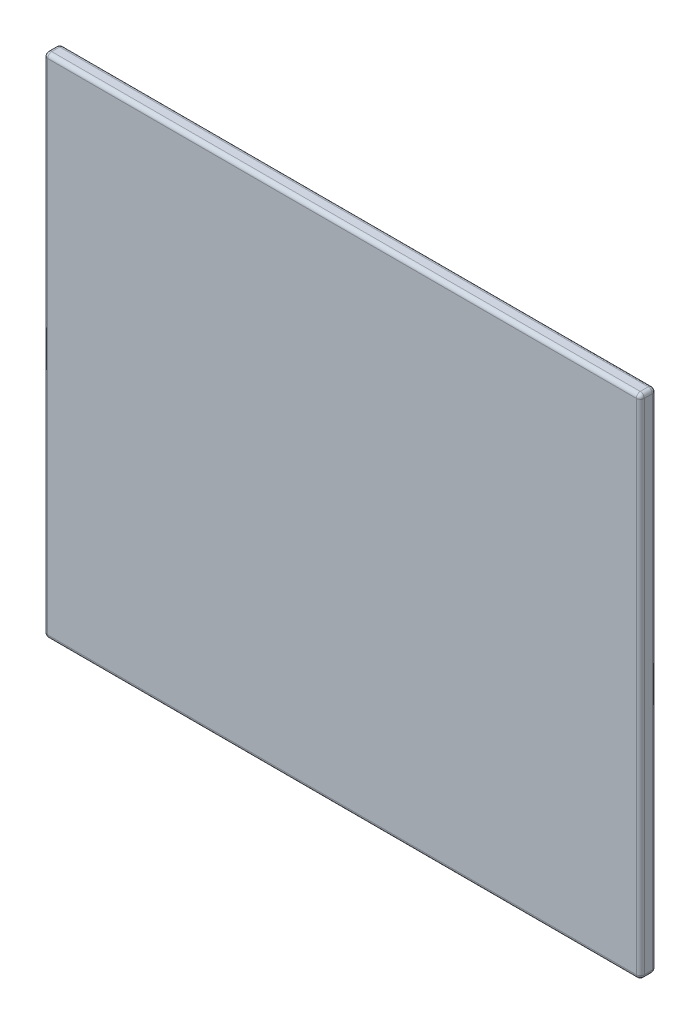
ISO-10303-21;
HEADER;
FILE_DESCRIPTION(('STEP AP214'),'2;1');
FILE_NAME('part.step','',(''),(''),'','','');
FILE_SCHEMA(('AUTOMOTIVE_DESIGN { 1 0 10303 214 1 1 1 1 }'));
ENDSEC;
DATA;
#1=APPLICATION_CONTEXT('core data for automotive mechanical design processes');
#2=APPLICATION_PROTOCOL_DEFINITION('international standard','automotive_design',2000,#1);
#3=PRODUCT_CONTEXT('',#1,'mechanical');
#4=PRODUCT('Part','Part','',(#3));
#5=PRODUCT_RELATED_PRODUCT_CATEGORY('part','',(#4));
#6=PRODUCT_DEFINITION_FORMATION('','',#4);
#7=PRODUCT_DEFINITION_CONTEXT('part definition',#1,'design');
#8=PRODUCT_DEFINITION('design','',#6,#7);
#9=PRODUCT_DEFINITION_SHAPE('','',#8);
#10=(LENGTH_UNIT() NAMED_UNIT(*) SI_UNIT(.MILLI.,.METRE.));
#11=(NAMED_UNIT(*) PLANE_ANGLE_UNIT() SI_UNIT($,.RADIAN.));
#12=(NAMED_UNIT(*) SI_UNIT($,.STERADIAN.) SOLID_ANGLE_UNIT());
#13=UNCERTAINTY_MEASURE_WITH_UNIT(LENGTH_MEASURE(1.E-05),#10,'distance_accuracy_value','');
#14=(GEOMETRIC_REPRESENTATION_CONTEXT(3) GLOBAL_UNCERTAINTY_ASSIGNED_CONTEXT((#13)) GLOBAL_UNIT_ASSIGNED_CONTEXT((#10,
#11,#12)) REPRESENTATION_CONTEXT('',''));
#15=CARTESIAN_POINT('',(0.,0.,0.));
#16=DIRECTION('',(0.,0.,1.));
#17=DIRECTION('',(1.,0.,0.));
#18=AXIS2_PLACEMENT_3D('',#15,#16,#17);
#19=CARTESIAN_POINT('',(37.35,-31.75,2.));
#20=DIRECTION('',(-1.,0.,0.));
#21=DIRECTION('',(0.,0.,1.));
#22=AXIS2_PLACEMENT_3D('',#19,#20,#21);
#23=PLANE('',#22);
#24=DIRECTION('',(0.,1.,0.));
#25=VECTOR('',#24,1.);
#26=CARTESIAN_POINT('',(37.35,-31.75,1.5));
#27=LINE('',#26,#25);
#28=CARTESIAN_POINT('',(37.35,31.25,1.5));
#29=VERTEX_POINT('',#28);
#30=CARTESIAN_POINT('',(37.35,-31.25,1.5));
#31=VERTEX_POINT('',#30);
#32=EDGE_CURVE('E42',#29,#31,#27,.F.);
#33=ORIENTED_EDGE('',*,*,#32,.T.);
#34=DIRECTION('',(0.,0.,-1.));
#35=VECTOR('',#34,1.);
#36=CARTESIAN_POINT('',(37.35,-31.25,2.));
#37=LINE('',#36,#35);
#38=CARTESIAN_POINT('',(37.35,-31.25,0.5));
#39=VERTEX_POINT('',#38);
#40=EDGE_CURVE('E11',#31,#39,#37,.T.);
#41=ORIENTED_EDGE('',*,*,#40,.T.);
#42=DIRECTION('',(0.,1.,0.));
#43=VECTOR('',#42,1.);
#44=CARTESIAN_POINT('',(37.35,31.75,0.5));
#45=LINE('',#44,#43);
#46=CARTESIAN_POINT('',(37.35,31.25,0.5));
#47=VERTEX_POINT('',#46);
#48=EDGE_CURVE('E194',#39,#47,#45,.T.);
#49=ORIENTED_EDGE('',*,*,#48,.T.);
#50=DIRECTION('',(0.,0.,-1.));
#51=VECTOR('',#50,1.);
#52=CARTESIAN_POINT('',(37.35,31.25,2.));
#53=LINE('',#52,#51);
#54=EDGE_CURVE('E53',#47,#29,#53,.F.);
#55=ORIENTED_EDGE('',*,*,#54,.T.);
#56=EDGE_LOOP('',(#33,#41,#49,#55));
#57=FACE_BOUND('',#56,.T.);
#58=ADVANCED_FACE('F33',(#57),#23,.F.);
#59=CARTESIAN_POINT('',(-37.35,31.75,2.));
#60=DIRECTION('',(0.,-1.,0.));
#61=DIRECTION('',(0.,0.,-1.));
#62=AXIS2_PLACEMENT_3D('',#59,#60,#61);
#63=PLANE('',#62);
#64=DIRECTION('',(0.,0.,-1.));
#65=VECTOR('',#64,1.);
#66=CARTESIAN_POINT('',(-36.85,31.75,2.));
#67=LINE('',#66,#65);
#68=CARTESIAN_POINT('',(-36.85,31.75,0.5));
#69=VERTEX_POINT('',#68);
#70=CARTESIAN_POINT('',(-36.85,31.75,1.5));
#71=VERTEX_POINT('',#70);
#72=EDGE_CURVE('E189',#69,#71,#67,.F.);
#73=ORIENTED_EDGE('',*,*,#72,.T.);
#74=DIRECTION('',(-1.,0.,0.));
#75=VECTOR('',#74,1.);
#76=CARTESIAN_POINT('',(-37.35,31.75,1.5));
#77=LINE('',#76,#75);
#78=CARTESIAN_POINT('',(36.85,31.75,1.5));
#79=VERTEX_POINT('',#78);
#80=EDGE_CURVE('E191',#71,#79,#77,.F.);
#81=ORIENTED_EDGE('',*,*,#80,.T.);
#82=DIRECTION('',(0.,0.,-1.));
#83=VECTOR('',#82,1.);
#84=CARTESIAN_POINT('',(36.85,31.75,2.));
#85=LINE('',#84,#83);
#86=CARTESIAN_POINT('',(36.85,31.75,0.5));
#87=VERTEX_POINT('',#86);
#88=EDGE_CURVE('E185',#79,#87,#85,.T.);
#89=ORIENTED_EDGE('',*,*,#88,.T.);
#90=DIRECTION('',(-1.,0.,0.));
#91=VECTOR('',#90,1.);
#92=CARTESIAN_POINT('',(-37.35,31.75,0.5));
#93=LINE('',#92,#91);
#94=EDGE_CURVE('E187',#87,#69,#93,.T.);
#95=ORIENTED_EDGE('',*,*,#94,.T.);
#96=EDGE_LOOP('',(#73,#81,#89,#95));
#97=FACE_BOUND('',#96,.T.);
#98=ADVANCED_FACE('F278',(#97),#63,.F.);
#99=CARTESIAN_POINT('',(-37.35,-31.75,2.));
#100=DIRECTION('',(1.,0.,0.));
#101=DIRECTION('',(0.,0.,-1.));
#102=AXIS2_PLACEMENT_3D('',#99,#100,#101);
#103=PLANE('',#102);
#104=DIRECTION('',(0.,0.,-1.));
#105=VECTOR('',#104,1.);
#106=CARTESIAN_POINT('',(-37.35,-31.25,2.));
#107=LINE('',#106,#105);
#108=CARTESIAN_POINT('',(-37.35,-31.25,0.5));
#109=VERTEX_POINT('',#108);
#110=CARTESIAN_POINT('',(-37.35,-31.25,1.5));
#111=VERTEX_POINT('',#110);
#112=EDGE_CURVE('E180',#109,#111,#107,.F.);
#113=ORIENTED_EDGE('',*,*,#112,.T.);
#114=DIRECTION('',(0.,-1.,0.));
#115=VECTOR('',#114,1.);
#116=CARTESIAN_POINT('',(-37.35,-31.75,1.5));
#117=LINE('',#116,#115);
#118=CARTESIAN_POINT('',(-37.35,31.25,1.5));
#119=VERTEX_POINT('',#118);
#120=EDGE_CURVE('E182',#111,#119,#117,.F.);
#121=ORIENTED_EDGE('',*,*,#120,.T.);
#122=DIRECTION('',(0.,0.,-1.));
#123=VECTOR('',#122,1.);
#124=CARTESIAN_POINT('',(-37.35,31.25,2.));
#125=LINE('',#124,#123);
#126=CARTESIAN_POINT('',(-37.35,31.25,0.5));
#127=VERTEX_POINT('',#126);
#128=EDGE_CURVE('E176',#119,#127,#125,.T.);
#129=ORIENTED_EDGE('',*,*,#128,.T.);
#130=DIRECTION('',(0.,-1.,0.));
#131=VECTOR('',#130,1.);
#132=CARTESIAN_POINT('',(-37.35,-31.75,0.5));
#133=LINE('',#132,#131);
#134=EDGE_CURVE('E178',#127,#109,#133,.T.);
#135=ORIENTED_EDGE('',*,*,#134,.T.);
#136=EDGE_LOOP('',(#113,#121,#129,#135));
#137=FACE_BOUND('',#136,.T.);
#138=ADVANCED_FACE('F269',(#137),#103,.F.);
#139=CARTESIAN_POINT('',(-37.35,-31.75,2.));
#140=DIRECTION('',(0.,1.,0.));
#141=DIRECTION('',(0.,0.,1.));
#142=AXIS2_PLACEMENT_3D('',#139,#140,#141);
#143=PLANE('',#142);
#144=DIRECTION('',(1.,0.,0.));
#145=VECTOR('',#144,1.);
#146=CARTESIAN_POINT('',(-37.35,-31.75,1.5));
#147=LINE('',#146,#145);
#148=CARTESIAN_POINT('',(36.85,-31.75,1.5));
#149=VERTEX_POINT('',#148);
#150=CARTESIAN_POINT('',(-36.85,-31.75,1.5));
#151=VERTEX_POINT('',#150);
#152=EDGE_CURVE('E129',#149,#151,#147,.F.);
#153=ORIENTED_EDGE('',*,*,#152,.T.);
#154=DIRECTION('',(0.,0.,-1.));
#155=VECTOR('',#154,1.);
#156=CARTESIAN_POINT('',(-36.85,-31.75,2.));
#157=LINE('',#156,#155);
#158=CARTESIAN_POINT('',(-36.85,-31.75,0.5));
#159=VERTEX_POINT('',#158);
#160=EDGE_CURVE('E165',#151,#159,#157,.T.);
#161=ORIENTED_EDGE('',*,*,#160,.T.);
#162=DIRECTION('',(1.,0.,0.));
#163=VECTOR('',#162,1.);
#164=CARTESIAN_POINT('',(37.35,-31.75,0.5));
#165=LINE('',#164,#163);
#166=CARTESIAN_POINT('',(36.85,-31.75,0.5));
#167=VERTEX_POINT('',#166);
#168=EDGE_CURVE('E158',#159,#167,#165,.T.);
#169=ORIENTED_EDGE('',*,*,#168,.T.);
#170=DIRECTION('',(0.,0.,-1.));
#171=VECTOR('',#170,1.);
#172=CARTESIAN_POINT('',(36.85,-31.75,2.));
#173=LINE('',#172,#171);
#174=EDGE_CURVE('E156',#167,#149,#173,.F.);
#175=ORIENTED_EDGE('',*,*,#174,.T.);
#176=EDGE_LOOP('',(#153,#161,#169,#175));
#177=FACE_BOUND('',#176,.T.);
#178=ADVANCED_FACE('F356',(#177),#143,.F.);
#179=CARTESIAN_POINT('',(0.,0.,2.));
#180=DIRECTION('',(0.,0.,-1.));
#181=DIRECTION('',(-1.,0.,0.));
#182=AXIS2_PLACEMENT_3D('',#179,#180,#181);
#183=PLANE('',#182);
#184=DIRECTION('',(0.,-1.,0.));
#185=VECTOR('',#184,1.);
#186=CARTESIAN_POINT('',(-36.85,0.,2.));
#187=LINE('',#186,#185);
#188=CARTESIAN_POINT('',(-36.85,31.25,2.));
#189=VERTEX_POINT('',#188);
#190=CARTESIAN_POINT('',(-36.85,-31.25,2.));
#191=VERTEX_POINT('',#190);
#192=EDGE_CURVE('E154',#189,#191,#187,.T.);
#193=ORIENTED_EDGE('',*,*,#192,.T.);
#194=DIRECTION('',(1.,0.,0.));
#195=VECTOR('',#194,1.);
#196=CARTESIAN_POINT('',(0.,-31.25,2.));
#197=LINE('',#196,#195);
#198=CARTESIAN_POINT('',(36.85,-31.25,2.));
#199=VERTEX_POINT('',#198);
#200=EDGE_CURVE('E127',#191,#199,#197,.T.);
#201=ORIENTED_EDGE('',*,*,#200,.T.);
#202=DIRECTION('',(0.,1.,0.));
#203=VECTOR('',#202,1.);
#204=CARTESIAN_POINT('',(36.85,0.,2.));
#205=LINE('',#204,#203);
#206=CARTESIAN_POINT('',(36.85,31.25,2.));
#207=VERTEX_POINT('',#206);
#208=EDGE_CURVE('E144',#199,#207,#205,.T.);
#209=ORIENTED_EDGE('',*,*,#208,.T.);
#210=DIRECTION('',(-1.,0.,0.));
#211=VECTOR('',#210,1.);
#212=CARTESIAN_POINT('',(0.,31.25,2.));
#213=LINE('',#212,#211);
#214=EDGE_CURVE('E150',#207,#189,#213,.T.);
#215=ORIENTED_EDGE('',*,*,#214,.T.);
#216=EDGE_LOOP('',(#193,#201,#209,#215));
#217=FACE_BOUND('',#216,.T.);
#218=ADVANCED_FACE('F152',(#217),#183,.F.);
#219=CARTESIAN_POINT('',(0.,0.,0.));
#220=DIRECTION('',(0.,0.,-1.));
#221=DIRECTION('',(-1.,0.,0.));
#222=AXIS2_PLACEMENT_3D('',#219,#220,#221);
#223=PLANE('',#222);
#224=DIRECTION('',(0.,1.,0.));
#225=VECTOR('',#224,1.);
#226=CARTESIAN_POINT('',(36.85,-31.75,0.));
#227=LINE('',#226,#225);
#228=CARTESIAN_POINT('',(36.85,31.25,0.));
#229=VERTEX_POINT('',#228);
#230=CARTESIAN_POINT('',(36.85,-31.25,0.));
#231=VERTEX_POINT('',#230);
#232=EDGE_CURVE('E167',#229,#231,#227,.F.);
#233=ORIENTED_EDGE('',*,*,#232,.T.);
#234=DIRECTION('',(1.,0.,0.));
#235=VECTOR('',#234,1.);
#236=CARTESIAN_POINT('',(-37.35,-31.25,0.));
#237=LINE('',#236,#235);
#238=CARTESIAN_POINT('',(-36.85,-31.25,0.));
#239=VERTEX_POINT('',#238);
#240=EDGE_CURVE('E173',#231,#239,#237,.F.);
#241=ORIENTED_EDGE('',*,*,#240,.T.);
#242=DIRECTION('',(0.,-1.,0.));
#243=VECTOR('',#242,1.);
#244=CARTESIAN_POINT('',(-36.85,31.75,0.));
#245=LINE('',#244,#243);
#246=CARTESIAN_POINT('',(-36.85,31.25,0.));
#247=VERTEX_POINT('',#246);
#248=EDGE_CURVE('E171',#239,#247,#245,.F.);
#249=ORIENTED_EDGE('',*,*,#248,.T.);
#250=DIRECTION('',(-1.,0.,0.));
#251=VECTOR('',#250,1.);
#252=CARTESIAN_POINT('',(37.35,31.25,0.));
#253=LINE('',#252,#251);
#254=EDGE_CURVE('E169',#247,#229,#253,.F.);
#255=ORIENTED_EDGE('',*,*,#254,.T.);
#256=EDGE_LOOP('',(#233,#241,#249,#255));
#257=FACE_BOUND('',#256,.T.);
#258=ADVANCED_FACE('F296',(#257),#223,.T.);
#259=CARTESIAN_POINT('',(-37.35,31.25,0.5));
#260=DIRECTION('',(1.,0.,0.));
#261=DIRECTION('',(0.,0.,-1.));
#262=AXIS2_PLACEMENT_3D('',#259,#260,#261);
#263=CYLINDRICAL_SURFACE('',#262,0.5);
#264=CARTESIAN_POINT('',(-36.85,31.25,0.5));
#265=DIRECTION('',(-1.,0.,0.));
#266=DIRECTION('',(0.,0.,1.));
#267=AXIS2_PLACEMENT_3D('',#264,#265,#266);
#268=CIRCLE('',#267,0.5);
#269=EDGE_CURVE('E37',#69,#247,#268,.T.);
#270=ORIENTED_EDGE('',*,*,#269,.F.);
#271=ORIENTED_EDGE('',*,*,#94,.F.);
#272=CARTESIAN_POINT('',(36.85,31.25,0.5));
#273=DIRECTION('',(1.,0.,0.));
#274=DIRECTION('',(0.,0.,-1.));
#275=AXIS2_PLACEMENT_3D('',#272,#273,#274);
#276=CIRCLE('',#275,0.5);
#277=EDGE_CURVE('E246',#229,#87,#276,.T.);
#278=ORIENTED_EDGE('',*,*,#277,.F.);
#279=ORIENTED_EDGE('',*,*,#254,.F.);
#280=EDGE_LOOP('',(#270,#271,#278,#279));
#281=FACE_BOUND('',#280,.T.);
#282=ADVANCED_FACE('F35',(#281),#263,.T.);
#283=CARTESIAN_POINT('',(-36.85,31.25,0.5));
#284=DIRECTION('',(0.,0.,1.));
#285=DIRECTION('',(1.,0.,0.));
#286=AXIS2_PLACEMENT_3D('',#283,#284,#285);
#287=SPHERICAL_SURFACE('',#286,0.5);
#288=CARTESIAN_POINT('',(-36.85,31.25,0.5));
#289=DIRECTION('',(0.,0.,-1.));
#290=DIRECTION('',(-1.,0.,0.));
#291=AXIS2_PLACEMENT_3D('',#288,#289,#290);
#292=CIRCLE('',#291,0.5);
#293=EDGE_CURVE('E241',#69,#127,#292,.F.);
#294=ORIENTED_EDGE('',*,*,#293,.F.);
#295=ORIENTED_EDGE('',*,*,#269,.T.);
#296=CARTESIAN_POINT('',(-36.85,31.25,0.5));
#297=DIRECTION('',(0.,1.,0.));
#298=DIRECTION('',(0.,0.,1.));
#299=AXIS2_PLACEMENT_3D('',#296,#297,#298);
#300=CIRCLE('',#299,0.5);
#301=EDGE_CURVE('E244',#127,#247,#300,.F.);
#302=ORIENTED_EDGE('',*,*,#301,.F.);
#303=EDGE_LOOP('',(#294,#295,#302));
#304=FACE_BOUND('',#303,.T.);
#305=ADVANCED_FACE('F257',(#304),#287,.T.);
#306=CARTESIAN_POINT('',(36.85,31.25,0.5));
#307=DIRECTION('',(0.,0.,1.));
#308=DIRECTION('',(1.,0.,0.));
#309=AXIS2_PLACEMENT_3D('',#306,#307,#308);
#310=SPHERICAL_SURFACE('',#309,0.5);
#311=CARTESIAN_POINT('',(36.85,31.25,0.5));
#312=DIRECTION('',(0.,1.,0.));
#313=DIRECTION('',(0.,0.,1.));
#314=AXIS2_PLACEMENT_3D('',#311,#312,#313);
#315=CIRCLE('',#314,0.5);
#316=EDGE_CURVE('E235',#229,#47,#315,.F.);
#317=ORIENTED_EDGE('',*,*,#316,.F.);
#318=ORIENTED_EDGE('',*,*,#277,.T.);
#319=CARTESIAN_POINT('',(36.85,31.25,0.5));
#320=DIRECTION('',(0.,0.,-1.));
#321=DIRECTION('',(-1.,0.,0.));
#322=AXIS2_PLACEMENT_3D('',#319,#320,#321);
#323=CIRCLE('',#322,0.5);
#324=EDGE_CURVE('E238',#47,#87,#323,.F.);
#325=ORIENTED_EDGE('',*,*,#324,.F.);
#326=EDGE_LOOP('',(#317,#318,#325));
#327=FACE_BOUND('',#326,.T.);
#328=ADVANCED_FACE('F289',(#327),#310,.T.);
#329=CARTESIAN_POINT('',(-36.85,-31.75,0.5));
#330=DIRECTION('',(0.,1.,0.));
#331=DIRECTION('',(0.,0.,1.));
#332=AXIS2_PLACEMENT_3D('',#329,#330,#331);
#333=CYLINDRICAL_SURFACE('',#332,0.5);
#334=ORIENTED_EDGE('',*,*,#301,.T.);
#335=ORIENTED_EDGE('',*,*,#248,.F.);
#336=CARTESIAN_POINT('',(-36.85,-31.25,0.5));
#337=DIRECTION('',(0.,-1.,0.));
#338=DIRECTION('',(0.,0.,-1.));
#339=AXIS2_PLACEMENT_3D('',#336,#337,#338);
#340=CIRCLE('',#339,0.5);
#341=EDGE_CURVE('E230',#109,#239,#340,.T.);
#342=ORIENTED_EDGE('',*,*,#341,.F.);
#343=ORIENTED_EDGE('',*,*,#134,.F.);
#344=EDGE_LOOP('',(#334,#335,#342,#343));
#345=FACE_BOUND('',#344,.T.);
#346=ADVANCED_FACE('F265',(#345),#333,.T.);
#347=CARTESIAN_POINT('',(-36.85,31.25,2.));
#348=DIRECTION('',(0.,0.,-1.));
#349=DIRECTION('',(-1.,0.,0.));
#350=AXIS2_PLACEMENT_3D('',#347,#348,#349);
#351=CYLINDRICAL_SURFACE('',#350,0.5);
#352=ORIENTED_EDGE('',*,*,#293,.T.);
#353=ORIENTED_EDGE('',*,*,#128,.F.);
#354=CARTESIAN_POINT('',(-36.85,31.25,1.5));
#355=DIRECTION('',(0.,0.,1.));
#356=DIRECTION('',(1.,0.,0.));
#357=AXIS2_PLACEMENT_3D('',#354,#355,#356);
#358=CIRCLE('',#357,0.5);
#359=EDGE_CURVE('E227',#71,#119,#358,.T.);
#360=ORIENTED_EDGE('',*,*,#359,.F.);
#361=ORIENTED_EDGE('',*,*,#72,.F.);
#362=EDGE_LOOP('',(#352,#353,#360,#361));
#363=FACE_BOUND('',#362,.T.);
#364=ADVANCED_FACE('F275',(#363),#351,.T.);
#365=CARTESIAN_POINT('',(0.,31.25,1.5));
#366=DIRECTION('',(-1.,0.,0.));
#367=DIRECTION('',(0.,0.,1.));
#368=AXIS2_PLACEMENT_3D('',#365,#366,#367);
#369=CYLINDRICAL_SURFACE('',#368,0.5);
#370=CARTESIAN_POINT('',(36.85,31.25,1.5));
#371=DIRECTION('',(1.,0.,0.));
#372=DIRECTION('',(0.,0.,-1.));
#373=AXIS2_PLACEMENT_3D('',#370,#371,#372);
#374=CIRCLE('',#373,0.5);
#375=EDGE_CURVE('E221',#79,#207,#374,.T.);
#376=ORIENTED_EDGE('',*,*,#375,.F.);
#377=ORIENTED_EDGE('',*,*,#80,.F.);
#378=CARTESIAN_POINT('',(-36.85,31.25,1.5));
#379=DIRECTION('',(-1.,0.,0.));
#380=DIRECTION('',(0.,0.,1.));
#381=AXIS2_PLACEMENT_3D('',#378,#379,#380);
#382=CIRCLE('',#381,0.5);
#383=EDGE_CURVE('E224',#189,#71,#382,.T.);
#384=ORIENTED_EDGE('',*,*,#383,.F.);
#385=ORIENTED_EDGE('',*,*,#214,.F.);
#386=EDGE_LOOP('',(#376,#377,#384,#385));
#387=FACE_BOUND('',#386,.T.);
#388=ADVANCED_FACE('F282',(#387),#369,.T.);
#389=CARTESIAN_POINT('',(36.85,31.25,2.));
#390=DIRECTION('',(0.,0.,-1.));
#391=DIRECTION('',(-1.,0.,0.));
#392=AXIS2_PLACEMENT_3D('',#389,#390,#391);
#393=CYLINDRICAL_SURFACE('',#392,0.5);
#394=ORIENTED_EDGE('',*,*,#324,.T.);
#395=ORIENTED_EDGE('',*,*,#88,.F.);
#396=CARTESIAN_POINT('',(36.85,31.25,1.5));
#397=DIRECTION('',(0.,0.,1.));
#398=DIRECTION('',(1.,0.,0.));
#399=AXIS2_PLACEMENT_3D('',#396,#397,#398);
#400=CIRCLE('',#399,0.5);
#401=EDGE_CURVE('E219',#29,#79,#400,.T.);
#402=ORIENTED_EDGE('',*,*,#401,.F.);
#403=ORIENTED_EDGE('',*,*,#54,.F.);
#404=EDGE_LOOP('',(#394,#395,#402,#403));
#405=FACE_BOUND('',#404,.T.);
#406=ADVANCED_FACE('F287',(#405),#393,.T.);
#407=CARTESIAN_POINT('',(36.85,-31.75,0.5));
#408=DIRECTION('',(0.,-1.,0.));
#409=DIRECTION('',(0.,0.,-1.));
#410=AXIS2_PLACEMENT_3D('',#407,#408,#409);
#411=CYLINDRICAL_SURFACE('',#410,0.5);
#412=ORIENTED_EDGE('',*,*,#316,.T.);
#413=ORIENTED_EDGE('',*,*,#48,.F.);
#414=CARTESIAN_POINT('',(36.85,-31.25,0.5));
#415=DIRECTION('',(0.,-1.,0.));
#416=DIRECTION('',(0.,0.,-1.));
#417=AXIS2_PLACEMENT_3D('',#414,#415,#416);
#418=CIRCLE('',#417,0.5);
#419=EDGE_CURVE('E216',#231,#39,#418,.T.);
#420=ORIENTED_EDGE('',*,*,#419,.F.);
#421=ORIENTED_EDGE('',*,*,#232,.F.);
#422=EDGE_LOOP('',(#412,#413,#420,#421));
#423=FACE_BOUND('',#422,.T.);
#424=ADVANCED_FACE('F293',(#423),#411,.T.);
#425=CARTESIAN_POINT('',(-37.35,-31.25,0.5));
#426=DIRECTION('',(-1.,0.,0.));
#427=DIRECTION('',(0.,0.,1.));
#428=AXIS2_PLACEMENT_3D('',#425,#426,#427);
#429=CYLINDRICAL_SURFACE('',#428,0.5);
#430=CARTESIAN_POINT('',(-36.85,-31.25,0.5));
#431=DIRECTION('',(-1.,0.,0.));
#432=DIRECTION('',(0.,0.,1.));
#433=AXIS2_PLACEMENT_3D('',#430,#431,#432);
#434=CIRCLE('',#433,0.5);
#435=EDGE_CURVE('E232',#239,#159,#434,.T.);
#436=ORIENTED_EDGE('',*,*,#435,.F.);
#437=ORIENTED_EDGE('',*,*,#240,.F.);
#438=CARTESIAN_POINT('',(36.85,-31.25,0.5));
#439=DIRECTION('',(1.,0.,0.));
#440=DIRECTION('',(0.,0.,-1.));
#441=AXIS2_PLACEMENT_3D('',#438,#439,#440);
#442=CIRCLE('',#441,0.5);
#443=EDGE_CURVE('E213',#167,#231,#442,.T.);
#444=ORIENTED_EDGE('',*,*,#443,.F.);
#445=ORIENTED_EDGE('',*,*,#168,.F.);
#446=EDGE_LOOP('',(#436,#437,#444,#445));
#447=FACE_BOUND('',#446,.T.);
#448=ADVANCED_FACE('F300',(#447),#429,.T.);
#449=CARTESIAN_POINT('',(-36.85,-31.25,0.5));
#450=DIRECTION('',(0.,0.,1.));
#451=DIRECTION('',(1.,0.,0.));
#452=AXIS2_PLACEMENT_3D('',#449,#450,#451);
#453=SPHERICAL_SURFACE('',#452,0.5);
#454=ORIENTED_EDGE('',*,*,#341,.T.);
#455=ORIENTED_EDGE('',*,*,#435,.T.);
#456=CARTESIAN_POINT('',(-36.85,-31.25,0.5));
#457=DIRECTION('',(0.,0.,-1.));
#458=DIRECTION('',(-1.,0.,0.));
#459=AXIS2_PLACEMENT_3D('',#456,#457,#458);
#460=CIRCLE('',#459,0.5);
#461=EDGE_CURVE('E210',#109,#159,#460,.F.);
#462=ORIENTED_EDGE('',*,*,#461,.F.);
#463=EDGE_LOOP('',(#454,#455,#462));
#464=FACE_BOUND('',#463,.T.);
#465=ADVANCED_FACE('F304',(#464),#453,.T.);
#466=CARTESIAN_POINT('',(-36.85,31.25,1.5));
#467=DIRECTION('',(0.,0.,1.));
#468=DIRECTION('',(1.,0.,0.));
#469=AXIS2_PLACEMENT_3D('',#466,#467,#468);
#470=SPHERICAL_SURFACE('',#469,0.5);
#471=ORIENTED_EDGE('',*,*,#383,.T.);
#472=ORIENTED_EDGE('',*,*,#359,.T.);
#473=CARTESIAN_POINT('',(-36.85,31.25,1.5));
#474=DIRECTION('',(0.,1.,0.));
#475=DIRECTION('',(0.,0.,1.));
#476=AXIS2_PLACEMENT_3D('',#473,#474,#475);
#477=CIRCLE('',#476,0.5);
#478=EDGE_CURVE('E208',#189,#119,#477,.F.);
#479=ORIENTED_EDGE('',*,*,#478,.F.);
#480=EDGE_LOOP('',(#471,#472,#479));
#481=FACE_BOUND('',#480,.T.);
#482=ADVANCED_FACE('F315',(#481),#470,.T.);
#483=CARTESIAN_POINT('',(36.85,31.25,1.5));
#484=DIRECTION('',(0.,0.,1.));
#485=DIRECTION('',(1.,0.,0.));
#486=AXIS2_PLACEMENT_3D('',#483,#484,#485);
#487=SPHERICAL_SURFACE('',#486,0.5);
#488=ORIENTED_EDGE('',*,*,#401,.T.);
#489=ORIENTED_EDGE('',*,*,#375,.T.);
#490=CARTESIAN_POINT('',(36.85,31.25,1.5));
#491=DIRECTION('',(0.,1.,0.));
#492=DIRECTION('',(0.,0.,1.));
#493=AXIS2_PLACEMENT_3D('',#490,#491,#492);
#494=CIRCLE('',#493,0.5);
#495=EDGE_CURVE('E147',#29,#207,#494,.F.);
#496=ORIENTED_EDGE('',*,*,#495,.F.);
#497=EDGE_LOOP('',(#488,#489,#496));
#498=FACE_BOUND('',#497,.T.);
#499=ADVANCED_FACE('F317',(#498),#487,.T.);
#500=CARTESIAN_POINT('',(36.85,-31.25,0.5));
#501=DIRECTION('',(0.,0.,1.));
#502=DIRECTION('',(1.,0.,0.));
#503=AXIS2_PLACEMENT_3D('',#500,#501,#502);
#504=SPHERICAL_SURFACE('',#503,0.5);
#505=ORIENTED_EDGE('',*,*,#443,.T.);
#506=ORIENTED_EDGE('',*,*,#419,.T.);
#507=CARTESIAN_POINT('',(36.85,-31.25,0.5));
#508=DIRECTION('',(0.,0.,-1.));
#509=DIRECTION('',(-1.,0.,0.));
#510=AXIS2_PLACEMENT_3D('',#507,#508,#509);
#511=CIRCLE('',#510,0.5);
#512=EDGE_CURVE('E205',#167,#39,#511,.F.);
#513=ORIENTED_EDGE('',*,*,#512,.F.);
#514=EDGE_LOOP('',(#505,#506,#513));
#515=FACE_BOUND('',#514,.T.);
#516=ADVANCED_FACE('F323',(#515),#504,.T.);
#517=CARTESIAN_POINT('',(-36.85,-31.25,2.));
#518=DIRECTION('',(0.,0.,-1.));
#519=DIRECTION('',(-1.,0.,0.));
#520=AXIS2_PLACEMENT_3D('',#517,#518,#519);
#521=CYLINDRICAL_SURFACE('',#520,0.5);
#522=ORIENTED_EDGE('',*,*,#461,.T.);
#523=ORIENTED_EDGE('',*,*,#160,.F.);
#524=CARTESIAN_POINT('',(-36.85,-31.25,1.5));
#525=DIRECTION('',(0.,0.,1.));
#526=DIRECTION('',(1.,0.,0.));
#527=AXIS2_PLACEMENT_3D('',#524,#525,#526);
#528=CIRCLE('',#527,0.5);
#529=EDGE_CURVE('E202',#111,#151,#528,.T.);
#530=ORIENTED_EDGE('',*,*,#529,.F.);
#531=ORIENTED_EDGE('',*,*,#112,.F.);
#532=EDGE_LOOP('',(#522,#523,#530,#531));
#533=FACE_BOUND('',#532,.T.);
#534=ADVANCED_FACE('F307',(#533),#521,.T.);
#535=CARTESIAN_POINT('',(-36.85,0.,1.5));
#536=DIRECTION('',(0.,-1.,0.));
#537=DIRECTION('',(0.,0.,-1.));
#538=AXIS2_PLACEMENT_3D('',#535,#536,#537);
#539=CYLINDRICAL_SURFACE('',#538,0.5);
#540=ORIENTED_EDGE('',*,*,#478,.T.);
#541=ORIENTED_EDGE('',*,*,#120,.F.);
#542=CARTESIAN_POINT('',(-36.85,-31.25,1.5));
#543=DIRECTION('',(0.,-1.,0.));
#544=DIRECTION('',(0.,0.,-1.));
#545=AXIS2_PLACEMENT_3D('',#542,#543,#544);
#546=CIRCLE('',#545,0.5);
#547=EDGE_CURVE('E141',#191,#111,#546,.T.);
#548=ORIENTED_EDGE('',*,*,#547,.F.);
#549=ORIENTED_EDGE('',*,*,#192,.F.);
#550=EDGE_LOOP('',(#540,#541,#548,#549));
#551=FACE_BOUND('',#550,.T.);
#552=ADVANCED_FACE('F313',(#551),#539,.T.);
#553=CARTESIAN_POINT('',(36.85,0.,1.5));
#554=DIRECTION('',(0.,1.,0.));
#555=DIRECTION('',(0.,0.,1.));
#556=AXIS2_PLACEMENT_3D('',#553,#554,#555);
#557=CYLINDRICAL_SURFACE('',#556,0.5);
#558=ORIENTED_EDGE('',*,*,#495,.T.);
#559=ORIENTED_EDGE('',*,*,#208,.F.);
#560=CARTESIAN_POINT('',(36.85,-31.25,1.5));
#561=DIRECTION('',(0.,-1.,0.));
#562=DIRECTION('',(0.,0.,-1.));
#563=AXIS2_PLACEMENT_3D('',#560,#561,#562);
#564=CIRCLE('',#563,0.5);
#565=EDGE_CURVE('E135',#31,#199,#564,.T.);
#566=ORIENTED_EDGE('',*,*,#565,.F.);
#567=ORIENTED_EDGE('',*,*,#32,.F.);
#568=EDGE_LOOP('',(#558,#559,#566,#567));
#569=FACE_BOUND('',#568,.T.);
#570=ADVANCED_FACE('F145',(#569),#557,.T.);
#571=CARTESIAN_POINT('',(36.85,-31.25,2.));
#572=DIRECTION('',(0.,0.,-1.));
#573=DIRECTION('',(-1.,0.,0.));
#574=AXIS2_PLACEMENT_3D('',#571,#572,#573);
#575=CYLINDRICAL_SURFACE('',#574,0.5);
#576=ORIENTED_EDGE('',*,*,#512,.T.);
#577=ORIENTED_EDGE('',*,*,#40,.F.);
#578=CARTESIAN_POINT('',(36.85,-31.25,1.5));
#579=DIRECTION('',(0.,0.,1.));
#580=DIRECTION('',(1.,0.,0.));
#581=AXIS2_PLACEMENT_3D('',#578,#579,#580);
#582=CIRCLE('',#581,0.5);
#583=EDGE_CURVE('E139',#149,#31,#582,.T.);
#584=ORIENTED_EDGE('',*,*,#583,.F.);
#585=ORIENTED_EDGE('',*,*,#174,.F.);
#586=EDGE_LOOP('',(#576,#577,#584,#585));
#587=FACE_BOUND('',#586,.T.);
#588=ADVANCED_FACE('F340',(#587),#575,.T.);
#589=CARTESIAN_POINT('',(-36.85,-31.25,1.5));
#590=DIRECTION('',(0.,0.,1.));
#591=DIRECTION('',(1.,0.,0.));
#592=AXIS2_PLACEMENT_3D('',#589,#590,#591);
#593=SPHERICAL_SURFACE('',#592,0.5);
#594=ORIENTED_EDGE('',*,*,#547,.T.);
#595=ORIENTED_EDGE('',*,*,#529,.T.);
#596=CARTESIAN_POINT('',(-36.85,-31.25,1.5));
#597=DIRECTION('',(-1.,0.,0.));
#598=DIRECTION('',(0.,0.,1.));
#599=AXIS2_PLACEMENT_3D('',#596,#597,#598);
#600=CIRCLE('',#599,0.5);
#601=EDGE_CURVE('E132',#191,#151,#600,.F.);
#602=ORIENTED_EDGE('',*,*,#601,.F.);
#603=EDGE_LOOP('',(#594,#595,#602));
#604=FACE_BOUND('',#603,.T.);
#605=ADVANCED_FACE('F311',(#604),#593,.T.);
#606=CARTESIAN_POINT('',(36.85,-31.25,1.5));
#607=DIRECTION('',(0.,0.,1.));
#608=DIRECTION('',(1.,0.,0.));
#609=AXIS2_PLACEMENT_3D('',#606,#607,#608);
#610=SPHERICAL_SURFACE('',#609,0.5);
#611=ORIENTED_EDGE('',*,*,#583,.T.);
#612=ORIENTED_EDGE('',*,*,#565,.T.);
#613=CARTESIAN_POINT('',(36.85,-31.25,1.5));
#614=DIRECTION('',(1.,0.,0.));
#615=DIRECTION('',(0.,0.,-1.));
#616=AXIS2_PLACEMENT_3D('',#613,#614,#615);
#617=CIRCLE('',#616,0.5);
#618=EDGE_CURVE('E123',#149,#199,#617,.F.);
#619=ORIENTED_EDGE('',*,*,#618,.F.);
#620=EDGE_LOOP('',(#611,#612,#619));
#621=FACE_BOUND('',#620,.T.);
#622=ADVANCED_FACE('F137',(#621),#610,.T.);
#623=CARTESIAN_POINT('',(0.,-31.25,1.5));
#624=DIRECTION('',(1.,0.,0.));
#625=DIRECTION('',(0.,0.,-1.));
#626=AXIS2_PLACEMENT_3D('',#623,#624,#625);
#627=CYLINDRICAL_SURFACE('',#626,0.5);
#628=ORIENTED_EDGE('',*,*,#601,.T.);
#629=ORIENTED_EDGE('',*,*,#152,.F.);
#630=ORIENTED_EDGE('',*,*,#618,.T.);
#631=ORIENTED_EDGE('',*,*,#200,.F.);
#632=EDGE_LOOP('',(#628,#629,#630,#631));
#633=FACE_BOUND('',#632,.T.);
#634=ADVANCED_FACE('F125',(#633),#627,.T.);
#635=CLOSED_SHELL('',(#58,#98,#138,#178,#218,#258,#282,#305,#328,#346,#364,#388,#406,#424,#448,
#465,#482,#499,#516,#534,#552,#570,#588,#605,#622,#634));
#636=MANIFOLD_SOLID_BREP('B2',#635);
#637=ADVANCED_BREP_SHAPE_REPRESENTATION('',(#18,#636),#14);
#638=SHAPE_DEFINITION_REPRESENTATION(#9,#637);
ENDSEC;
END-ISO-10303-21;
